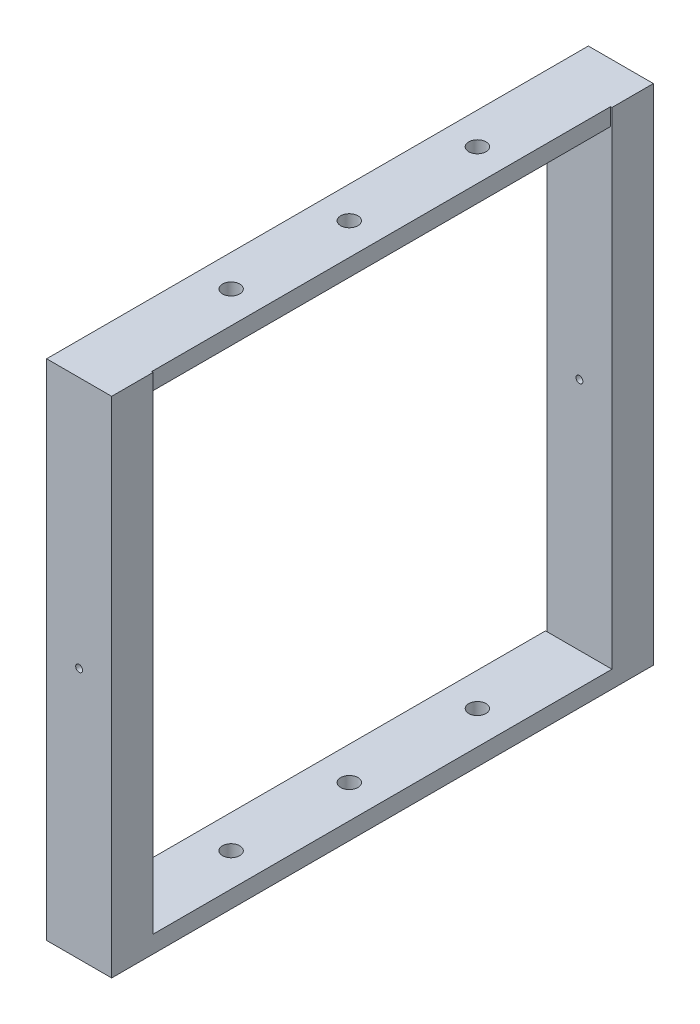
ISO-10303-21;
HEADER;
FILE_DESCRIPTION(('STEP AP214'),'2;1');
FILE_NAME('part.step','',(''),(''),'','','');
FILE_SCHEMA(('AUTOMOTIVE_DESIGN { 1 0 10303 214 1 1 1 1 }'));
ENDSEC;
DATA;
#1=APPLICATION_CONTEXT('core data for automotive mechanical design processes');
#2=APPLICATION_PROTOCOL_DEFINITION('international standard','automotive_design',2000,#1);
#3=PRODUCT_CONTEXT('',#1,'mechanical');
#4=PRODUCT('Part','Part','',(#3));
#5=PRODUCT_RELATED_PRODUCT_CATEGORY('part','',(#4));
#6=PRODUCT_DEFINITION_FORMATION('','',#4);
#7=PRODUCT_DEFINITION_CONTEXT('part definition',#1,'design');
#8=PRODUCT_DEFINITION('design','',#6,#7);
#9=PRODUCT_DEFINITION_SHAPE('','',#8);
#10=(LENGTH_UNIT() NAMED_UNIT(*) SI_UNIT(.MILLI.,.METRE.));
#11=(NAMED_UNIT(*) PLANE_ANGLE_UNIT() SI_UNIT($,.RADIAN.));
#12=(NAMED_UNIT(*) SI_UNIT($,.STERADIAN.) SOLID_ANGLE_UNIT());
#13=UNCERTAINTY_MEASURE_WITH_UNIT(LENGTH_MEASURE(1.E-05),#10,'distance_accuracy_value','');
#14=(GEOMETRIC_REPRESENTATION_CONTEXT(3) GLOBAL_UNCERTAINTY_ASSIGNED_CONTEXT((#13)) GLOBAL_UNIT_ASSIGNED_CONTEXT((#10,
#11,#12)) REPRESENTATION_CONTEXT('',''));
#15=CARTESIAN_POINT('',(0.,0.,0.));
#16=DIRECTION('',(0.,0.,1.));
#17=DIRECTION('',(1.,0.,0.));
#18=AXIS2_PLACEMENT_3D('',#15,#16,#17);
#19=CARTESIAN_POINT('',(-66.5,136.,66.5));
#20=DIRECTION('',(0.,0.,-1.));
#21=DIRECTION('',(-1.,0.,0.));
#22=AXIS2_PLACEMENT_3D('',#19,#20,#21);
#23=PLANE('',#22);
#24=DIRECTION('',(0.,-1.,0.));
#25=VECTOR('',#24,1.);
#26=CARTESIAN_POINT('',(-9.2186374950583,141.,66.5));
#27=LINE('',#26,#25);
#28=CARTESIAN_POINT('',(-9.2186374950583,0.,66.5));
#29=VERTEX_POINT('',#28);
#30=CARTESIAN_POINT('',(-9.2186374950583,-5.,66.5));
#31=VERTEX_POINT('',#30);
#32=EDGE_CURVE('E46',#29,#31,#27,.T.);
#33=ORIENTED_EDGE('',*,*,#32,.F.);
#34=DIRECTION('',(-1.,0.,0.));
#35=VECTOR('',#34,1.);
#36=CARTESIAN_POINT('',(103.5,0.,66.5));
#37=LINE('',#36,#35);
#38=CARTESIAN_POINT('',(-9.63074428145545,0.,66.5));
#39=VERTEX_POINT('',#38);
#40=EDGE_CURVE('E241',#29,#39,#37,.T.);
#41=ORIENTED_EDGE('',*,*,#40,.T.);
#42=DIRECTION('',(0.,1.,0.));
#43=VECTOR('',#42,1.);
#44=CARTESIAN_POINT('',(-9.63074428145545,-5.,66.5));
#45=LINE('',#44,#43);
#46=CARTESIAN_POINT('',(-9.63074428145545,-5.,66.5));
#47=VERTEX_POINT('',#46);
#48=EDGE_CURVE('E175',#47,#39,#45,.T.);
#49=ORIENTED_EDGE('',*,*,#48,.F.);
#50=DIRECTION('',(-1.,0.,0.));
#51=VECTOR('',#50,1.);
#52=CARTESIAN_POINT('',(-9.63074428145545,-5.,66.5));
#53=LINE('',#52,#51);
#54=EDGE_CURVE('E189',#31,#47,#53,.T.);
#55=ORIENTED_EDGE('',*,*,#54,.F.);
#56=EDGE_LOOP('',(#33,#41,#49,#55));
#57=FACE_BOUND('',#56,.T.);
#58=ADVANCED_FACE('F35',(#57),#23,.F.);
#59=CARTESIAN_POINT('',(-66.5,136.,-66.5));
#60=DIRECTION('',(0.,0.,1.));
#61=DIRECTION('',(1.,0.,0.));
#62=AXIS2_PLACEMENT_3D('',#59,#60,#61);
#63=PLANE('',#62);
#64=DIRECTION('',(0.,1.,0.));
#65=VECTOR('',#64,1.);
#66=CARTESIAN_POINT('',(-9.63074428145545,-5.,-66.5));
#67=LINE('',#66,#65);
#68=CARTESIAN_POINT('',(-9.63074428145545,-5.,-66.5));
#69=VERTEX_POINT('',#68);
#70=CARTESIAN_POINT('',(-9.63074428145545,0.,-66.5));
#71=VERTEX_POINT('',#70);
#72=EDGE_CURVE('E197',#69,#71,#67,.T.);
#73=ORIENTED_EDGE('',*,*,#72,.T.);
#74=DIRECTION('',(-1.,0.,0.));
#75=VECTOR('',#74,1.);
#76=CARTESIAN_POINT('',(103.5,0.,-66.5));
#77=LINE('',#76,#75);
#78=CARTESIAN_POINT('',(-9.2186374950583,0.,-66.5));
#79=VERTEX_POINT('',#78);
#80=EDGE_CURVE('E237',#79,#71,#77,.T.);
#81=ORIENTED_EDGE('',*,*,#80,.F.);
#82=DIRECTION('',(0.,1.,0.));
#83=VECTOR('',#82,1.);
#84=CARTESIAN_POINT('',(-9.2186374950583,-5.,-66.5));
#85=LINE('',#84,#83);
#86=CARTESIAN_POINT('',(-9.2186374950583,-5.,-66.5));
#87=VERTEX_POINT('',#86);
#88=EDGE_CURVE('E157',#87,#79,#85,.T.);
#89=ORIENTED_EDGE('',*,*,#88,.F.);
#90=DIRECTION('',(1.,0.,0.));
#91=VECTOR('',#90,1.);
#92=CARTESIAN_POINT('',(-9.63074428145545,-5.,-66.5));
#93=LINE('',#92,#91);
#94=EDGE_CURVE('E194',#69,#87,#93,.T.);
#95=ORIENTED_EDGE('',*,*,#94,.F.);
#96=EDGE_LOOP('',(#73,#81,#89,#95));
#97=FACE_BOUND('',#96,.T.);
#98=ADVANCED_FACE('F37',(#97),#63,.F.);
#99=CARTESIAN_POINT('',(9.63074428145545,-5.,-66.5));
#100=DIRECTION('',(-1.,0.,0.));
#101=DIRECTION('',(0.,0.,1.));
#102=AXIS2_PLACEMENT_3D('',#99,#100,#101);
#103=PLANE('',#102);
#104=DIRECTION('',(0.,0.,1.));
#105=VECTOR('',#104,1.);
#106=CARTESIAN_POINT('',(9.63074428145545,0.,-66.5));
#107=LINE('',#106,#105);
#108=CARTESIAN_POINT('',(9.63074428145545,0.,-66.5));
#109=VERTEX_POINT('',#108);
#110=CARTESIAN_POINT('',(9.63074428145545,0.,66.5));
#111=VERTEX_POINT('',#110);
#112=EDGE_CURVE('E186',#109,#111,#107,.T.);
#113=ORIENTED_EDGE('',*,*,#112,.T.);
#114=DIRECTION('',(0.,1.,0.));
#115=VECTOR('',#114,1.);
#116=CARTESIAN_POINT('',(9.63074428145545,141.,66.5));
#117=LINE('',#116,#115);
#118=CARTESIAN_POINT('',(9.63074428145545,141.,66.5));
#119=VERTEX_POINT('',#118);
#120=EDGE_CURVE('E44',#111,#119,#117,.T.);
#121=ORIENTED_EDGE('',*,*,#120,.T.);
#122=DIRECTION('',(0.,0.,-1.));
#123=VECTOR('',#122,1.);
#124=CARTESIAN_POINT('',(9.63074428145545,141.,78.5));
#125=LINE('',#124,#123);
#126=CARTESIAN_POINT('',(9.63074428145545,141.,78.5));
#127=VERTEX_POINT('',#126);
#128=EDGE_CURVE('E268',#127,#119,#125,.T.);
#129=ORIENTED_EDGE('',*,*,#128,.F.);
#130=DIRECTION('',(0.,1.,0.));
#131=VECTOR('',#130,1.);
#132=CARTESIAN_POINT('',(9.63074428145545,141.,78.5));
#133=LINE('',#132,#131);
#134=CARTESIAN_POINT('',(9.63074428145545,-5.,78.5));
#135=VERTEX_POINT('',#134);
#136=EDGE_CURVE('E264',#135,#127,#133,.T.);
#137=ORIENTED_EDGE('',*,*,#136,.F.);
#138=DIRECTION('',(0.,0.,1.));
#139=VECTOR('',#138,1.);
#140=CARTESIAN_POINT('',(9.63074428145545,-5.,-66.5));
#141=LINE('',#140,#139);
#142=CARTESIAN_POINT('',(9.63074428145545,-5.,-78.5));
#143=VERTEX_POINT('',#142);
#144=EDGE_CURVE('E187',#143,#135,#141,.T.);
#145=ORIENTED_EDGE('',*,*,#144,.F.);
#146=DIRECTION('',(0.,-1.,0.));
#147=VECTOR('',#146,1.);
#148=CARTESIAN_POINT('',(9.63074428145545,-5.,-78.5));
#149=LINE('',#148,#147);
#150=CARTESIAN_POINT('',(9.63074428145545,141.,-78.5));
#151=VERTEX_POINT('',#150);
#152=EDGE_CURVE('E163',#151,#143,#149,.T.);
#153=ORIENTED_EDGE('',*,*,#152,.F.);
#154=DIRECTION('',(0.,0.,1.));
#155=VECTOR('',#154,1.);
#156=CARTESIAN_POINT('',(9.63074428145545,141.,-78.5));
#157=LINE('',#156,#155);
#158=CARTESIAN_POINT('',(9.63074428145545,141.,-66.5));
#159=VERTEX_POINT('',#158);
#160=EDGE_CURVE('E172',#151,#159,#157,.T.);
#161=ORIENTED_EDGE('',*,*,#160,.T.);
#162=DIRECTION('',(0.,-1.,0.));
#163=VECTOR('',#162,1.);
#164=CARTESIAN_POINT('',(9.63074428145545,-5.,-66.5));
#165=LINE('',#164,#163);
#166=EDGE_CURVE('E173',#159,#109,#165,.T.);
#167=ORIENTED_EDGE('',*,*,#166,.T.);
#168=EDGE_LOOP('',(#113,#121,#129,#137,#145,#153,#161,#167));
#169=FACE_BOUND('',#168,.T.);
#170=ADVANCED_FACE('F314',(#169),#103,.F.);
#171=CARTESIAN_POINT('',(-9.63074428145545,-5.,-66.5));
#172=DIRECTION('',(1.,0.,0.));
#173=DIRECTION('',(0.,0.,-1.));
#174=AXIS2_PLACEMENT_3D('',#171,#172,#173);
#175=PLANE('',#174);
#176=DIRECTION('',(0.,0.,-1.));
#177=VECTOR('',#176,1.);
#178=CARTESIAN_POINT('',(-9.63074428145545,0.,-66.5));
#179=LINE('',#178,#177);
#180=EDGE_CURVE('E190',#39,#71,#179,.T.);
#181=ORIENTED_EDGE('',*,*,#180,.T.);
#182=ORIENTED_EDGE('',*,*,#72,.F.);
#183=DIRECTION('',(0.,0.,-1.));
#184=VECTOR('',#183,1.);
#185=CARTESIAN_POINT('',(-9.63074428145545,-5.,-66.5));
#186=LINE('',#185,#184);
#187=EDGE_CURVE('E192',#47,#69,#186,.T.);
#188=ORIENTED_EDGE('',*,*,#187,.F.);
#189=ORIENTED_EDGE('',*,*,#48,.T.);
#190=EDGE_LOOP('',(#181,#182,#188,#189));
#191=FACE_BOUND('',#190,.T.);
#192=ADVANCED_FACE('F289',(#191),#175,.F.);
#193=CARTESIAN_POINT('',(0.,-5.,0.));
#194=DIRECTION('',(0.,1.,0.));
#195=DIRECTION('',(0.,0.,1.));
#196=AXIS2_PLACEMENT_3D('',#193,#194,#195);
#197=PLANE('',#196);
#198=CARTESIAN_POINT('',(0.,-5.,34.2453079122047));
#199=DIRECTION('',(0.,1.,0.));
#200=DIRECTION('',(0.,0.,1.));
#201=AXIS2_PLACEMENT_3D('',#198,#199,#200);
#202=CIRCLE('',#201,2.5);
#203=CARTESIAN_POINT('',(0.,-5.,36.7453079122047));
#204=VERTEX_POINT('',#203);
#205=EDGE_CURVE('E215',#204,#204,#202,.T.);
#206=ORIENTED_EDGE('',*,*,#205,.T.);
#207=EDGE_LOOP('',(#206));
#208=FACE_BOUND('',#207,.T.);
#209=CARTESIAN_POINT('',(0.,-5.,-37.1263663216455));
#210=DIRECTION('',(0.,1.,0.));
#211=DIRECTION('',(0.,0.,1.));
#212=AXIS2_PLACEMENT_3D('',#209,#210,#211);
#213=CIRCLE('',#212,2.5);
#214=CARTESIAN_POINT('',(0.,-5.,-34.6263663216455));
#215=VERTEX_POINT('',#214);
#216=EDGE_CURVE('E212',#215,#215,#213,.T.);
#217=ORIENTED_EDGE('',*,*,#216,.T.);
#218=EDGE_LOOP('',(#217));
#219=FACE_BOUND('',#218,.T.);
#220=CARTESIAN_POINT('',(0.,-5.,0.));
#221=DIRECTION('',(0.,1.,0.));
#222=DIRECTION('',(0.,0.,1.));
#223=AXIS2_PLACEMENT_3D('',#220,#221,#222);
#224=CIRCLE('',#223,2.5);
#225=CARTESIAN_POINT('',(0.,-5.,2.5));
#226=VERTEX_POINT('',#225);
#227=EDGE_CURVE('E235',#226,#226,#224,.T.);
#228=ORIENTED_EDGE('',*,*,#227,.T.);
#229=EDGE_LOOP('',(#228));
#230=FACE_BOUND('',#229,.T.);
#231=ORIENTED_EDGE('',*,*,#144,.T.);
#232=DIRECTION('',(1.,0.,0.));
#233=VECTOR('',#232,1.);
#234=CARTESIAN_POINT('',(-9.2186374950583,-5.,78.5));
#235=LINE('',#234,#233);
#236=CARTESIAN_POINT('',(-9.2186374950583,-5.,78.5));
#237=VERTEX_POINT('',#236);
#238=EDGE_CURVE('E260',#237,#135,#235,.T.);
#239=ORIENTED_EDGE('',*,*,#238,.F.);
#240=DIRECTION('',(0.,0.,-1.));
#241=VECTOR('',#240,1.);
#242=CARTESIAN_POINT('',(-9.2186374950583,-5.,78.5));
#243=LINE('',#242,#241);
#244=EDGE_CURVE('E149',#237,#31,#243,.T.);
#245=ORIENTED_EDGE('',*,*,#244,.T.);
#246=ORIENTED_EDGE('',*,*,#54,.T.);
#247=ORIENTED_EDGE('',*,*,#187,.T.);
#248=ORIENTED_EDGE('',*,*,#94,.T.);
#249=DIRECTION('',(0.,0.,1.));
#250=VECTOR('',#249,1.);
#251=CARTESIAN_POINT('',(-9.2186374950583,-5.,-78.5));
#252=LINE('',#251,#250);
#253=CARTESIAN_POINT('',(-9.2186374950583,-5.,-78.5));
#254=VERTEX_POINT('',#253);
#255=EDGE_CURVE('E183',#254,#87,#252,.T.);
#256=ORIENTED_EDGE('',*,*,#255,.F.);
#257=DIRECTION('',(-1.,0.,0.));
#258=VECTOR('',#257,1.);
#259=CARTESIAN_POINT('',(9.63074428145545,-5.,-78.5));
#260=LINE('',#259,#258);
#261=EDGE_CURVE('E166',#143,#254,#260,.T.);
#262=ORIENTED_EDGE('',*,*,#261,.F.);
#263=EDGE_LOOP('',(#231,#239,#245,#246,#247,#248,#256,#262));
#264=FACE_BOUND('',#263,.T.);
#265=ADVANCED_FACE('F294',(#208,#219,#230,#264),#197,.F.);
#266=CARTESIAN_POINT('',(-9.2186374950583,-5.,-78.5));
#267=DIRECTION('',(1.,0.,0.));
#268=DIRECTION('',(0.,0.,-1.));
#269=AXIS2_PLACEMENT_3D('',#266,#267,#268);
#270=PLANE('',#269);
#271=ORIENTED_EDGE('',*,*,#88,.T.);
#272=CARTESIAN_POINT('',(-9.2186374950583,136.,-66.5));
#273=VERTEX_POINT('',#272);
#274=EDGE_CURVE('E155',#79,#273,#85,.T.);
#275=ORIENTED_EDGE('',*,*,#274,.T.);
#276=DIRECTION('',(0.,0.,1.));
#277=VECTOR('',#276,1.);
#278=CARTESIAN_POINT('',(-9.2186374950583,136.,66.5));
#279=LINE('',#278,#277);
#280=CARTESIAN_POINT('',(-9.2186374950583,136.,66.5));
#281=VERTEX_POINT('',#280);
#282=EDGE_CURVE('E137',#273,#281,#279,.T.);
#283=ORIENTED_EDGE('',*,*,#282,.T.);
#284=EDGE_CURVE('E11',#281,#29,#27,.T.);
#285=ORIENTED_EDGE('',*,*,#284,.T.);
#286=ORIENTED_EDGE('',*,*,#32,.T.);
#287=ORIENTED_EDGE('',*,*,#244,.F.);
#288=DIRECTION('',(0.,-1.,0.));
#289=VECTOR('',#288,1.);
#290=CARTESIAN_POINT('',(-9.2186374950583,141.,78.5));
#291=LINE('',#290,#289);
#292=CARTESIAN_POINT('',(-9.2186374950583,141.,78.5));
#293=VERTEX_POINT('',#292);
#294=EDGE_CURVE('E257',#293,#237,#291,.T.);
#295=ORIENTED_EDGE('',*,*,#294,.F.);
#296=DIRECTION('',(0.,0.,1.));
#297=VECTOR('',#296,1.);
#298=CARTESIAN_POINT('',(-9.2186374950583,141.,-78.5));
#299=LINE('',#298,#297);
#300=CARTESIAN_POINT('',(-9.2186374950583,141.,-78.5));
#301=VERTEX_POINT('',#300);
#302=EDGE_CURVE('E181',#301,#293,#299,.T.);
#303=ORIENTED_EDGE('',*,*,#302,.F.);
#304=DIRECTION('',(0.,1.,0.));
#305=VECTOR('',#304,1.);
#306=CARTESIAN_POINT('',(-9.2186374950583,-5.,-78.5));
#307=LINE('',#306,#305);
#308=EDGE_CURVE('E168',#254,#301,#307,.T.);
#309=ORIENTED_EDGE('',*,*,#308,.F.);
#310=ORIENTED_EDGE('',*,*,#255,.T.);
#311=EDGE_LOOP('',(#271,#275,#283,#285,#286,#287,#295,#303,#309,#310));
#312=FACE_BOUND('',#311,.T.);
#313=ADVANCED_FACE('F277',(#312),#270,.F.);
#314=CARTESIAN_POINT('',(9.63074428145545,141.,-78.5));
#315=DIRECTION('',(0.,-1.,0.));
#316=DIRECTION('',(0.,0.,-1.));
#317=AXIS2_PLACEMENT_3D('',#314,#315,#316);
#318=PLANE('',#317);
#319=CARTESIAN_POINT('',(0.,141.,34.2453079122047));
#320=DIRECTION('',(0.,1.,0.));
#321=DIRECTION('',(0.,0.,1.));
#322=AXIS2_PLACEMENT_3D('',#319,#320,#321);
#323=CIRCLE('',#322,2.5);
#324=CARTESIAN_POINT('',(0.,141.,36.7453079122047));
#325=VERTEX_POINT('',#324);
#326=EDGE_CURVE('E401',#325,#325,#323,.T.);
#327=ORIENTED_EDGE('',*,*,#326,.F.);
#328=EDGE_LOOP('',(#327));
#329=FACE_BOUND('',#328,.T.);
#330=CARTESIAN_POINT('',(0.,141.,-37.1263663216455));
#331=DIRECTION('',(0.,1.,0.));
#332=DIRECTION('',(0.,0.,1.));
#333=AXIS2_PLACEMENT_3D('',#330,#331,#332);
#334=CIRCLE('',#333,2.5);
#335=CARTESIAN_POINT('',(0.,141.,-34.6263663216455));
#336=VERTEX_POINT('',#335);
#337=EDGE_CURVE('E208',#336,#336,#334,.T.);
#338=ORIENTED_EDGE('',*,*,#337,.F.);
#339=EDGE_LOOP('',(#338));
#340=FACE_BOUND('',#339,.T.);
#341=CARTESIAN_POINT('',(0.,141.,0.));
#342=DIRECTION('',(0.,-1.,0.));
#343=DIRECTION('',(0.,0.,-1.));
#344=AXIS2_PLACEMENT_3D('',#341,#342,#343);
#345=CIRCLE('',#344,2.5);
#346=CARTESIAN_POINT('',(0.,141.,-2.5));
#347=VERTEX_POINT('',#346);
#348=EDGE_CURVE('E229',#347,#347,#345,.F.);
#349=ORIENTED_EDGE('',*,*,#348,.F.);
#350=EDGE_LOOP('',(#349));
#351=FACE_BOUND('',#350,.T.);
#352=ORIENTED_EDGE('',*,*,#302,.T.);
#353=DIRECTION('',(-1.,0.,0.));
#354=VECTOR('',#353,1.);
#355=CARTESIAN_POINT('',(-9.2186374950583,141.,78.5));
#356=LINE('',#355,#354);
#357=EDGE_CURVE('E266',#127,#293,#356,.T.);
#358=ORIENTED_EDGE('',*,*,#357,.F.);
#359=ORIENTED_EDGE('',*,*,#128,.T.);
#360=DIRECTION('',(-1.,0.,0.));
#361=VECTOR('',#360,1.);
#362=CARTESIAN_POINT('',(-9.2186374950583,141.,66.5));
#363=LINE('',#362,#361);
#364=CARTESIAN_POINT('',(9.21863749505819,141.,66.5));
#365=VERTEX_POINT('',#364);
#366=EDGE_CURVE('E261',#119,#365,#363,.T.);
#367=ORIENTED_EDGE('',*,*,#366,.T.);
#368=DIRECTION('',(0.,0.,-1.));
#369=VECTOR('',#368,1.);
#370=CARTESIAN_POINT('',(9.21863749505819,141.,66.5));
#371=LINE('',#370,#369);
#372=CARTESIAN_POINT('',(9.21863749505819,141.,-66.5));
#373=VERTEX_POINT('',#372);
#374=EDGE_CURVE('E159',#365,#373,#371,.T.);
#375=ORIENTED_EDGE('',*,*,#374,.T.);
#376=DIRECTION('',(1.,0.,0.));
#377=VECTOR('',#376,1.);
#378=CARTESIAN_POINT('',(9.63074428145545,141.,-66.5));
#379=LINE('',#378,#377);
#380=EDGE_CURVE('E154',#373,#159,#379,.T.);
#381=ORIENTED_EDGE('',*,*,#380,.T.);
#382=ORIENTED_EDGE('',*,*,#160,.F.);
#383=DIRECTION('',(1.,0.,0.));
#384=VECTOR('',#383,1.);
#385=CARTESIAN_POINT('',(9.63074428145545,141.,-78.5));
#386=LINE('',#385,#384);
#387=EDGE_CURVE('E170',#301,#151,#386,.T.);
#388=ORIENTED_EDGE('',*,*,#387,.F.);
#389=EDGE_LOOP('',(#352,#358,#359,#367,#375,#381,#382,#388));
#390=FACE_BOUND('',#389,.T.);
#391=ADVANCED_FACE('F305',(#329,#340,#351,#390),#318,.F.);
#392=CARTESIAN_POINT('',(0.,0.,-78.5));
#393=DIRECTION('',(0.,0.,1.));
#394=DIRECTION('',(1.,0.,0.));
#395=AXIS2_PLACEMENT_3D('',#392,#393,#394);
#396=PLANE('',#395);
#397=CARTESIAN_POINT('',(0.206053393198581,68.,-78.5));
#398=DIRECTION('',(0.,0.,1.));
#399=DIRECTION('',(1.,0.,0.));
#400=AXIS2_PLACEMENT_3D('',#397,#398,#399);
#401=CIRCLE('',#400,1.);
#402=CARTESIAN_POINT('',(1.20605339319858,68.,-78.5));
#403=VERTEX_POINT('',#402);
#404=EDGE_CURVE('E246',#403,#403,#401,.T.);
#405=ORIENTED_EDGE('',*,*,#404,.T.);
#406=EDGE_LOOP('',(#405));
#407=FACE_BOUND('',#406,.T.);
#408=ORIENTED_EDGE('',*,*,#152,.T.);
#409=ORIENTED_EDGE('',*,*,#261,.T.);
#410=ORIENTED_EDGE('',*,*,#308,.T.);
#411=ORIENTED_EDGE('',*,*,#387,.T.);
#412=EDGE_LOOP('',(#408,#409,#410,#411));
#413=FACE_BOUND('',#412,.T.);
#414=ADVANCED_FACE('F310',(#407,#413),#396,.F.);
#415=CARTESIAN_POINT('',(0.,0.,-66.5));
#416=DIRECTION('',(0.,0.,1.));
#417=DIRECTION('',(1.,0.,0.));
#418=AXIS2_PLACEMENT_3D('',#415,#416,#417);
#419=PLANE('',#418);
#420=CARTESIAN_POINT('',(0.206053393198581,68.,-66.5));
#421=DIRECTION('',(0.,0.,1.));
#422=DIRECTION('',(1.,0.,0.));
#423=AXIS2_PLACEMENT_3D('',#420,#421,#422);
#424=CIRCLE('',#423,1.);
#425=CARTESIAN_POINT('',(1.20605339319858,68.,-66.5));
#426=VERTEX_POINT('',#425);
#427=EDGE_CURVE('E254',#426,#426,#424,.T.);
#428=ORIENTED_EDGE('',*,*,#427,.F.);
#429=EDGE_LOOP('',(#428));
#430=FACE_BOUND('',#429,.T.);
#431=ORIENTED_EDGE('',*,*,#166,.F.);
#432=ORIENTED_EDGE('',*,*,#380,.F.);
#433=DIRECTION('',(0.,-1.,0.));
#434=VECTOR('',#433,1.);
#435=CARTESIAN_POINT('',(9.21863749505819,141.,-66.5));
#436=LINE('',#435,#434);
#437=CARTESIAN_POINT('',(9.21863749505819,136.,-66.5));
#438=VERTEX_POINT('',#437);
#439=EDGE_CURVE('E145',#373,#438,#436,.T.);
#440=ORIENTED_EDGE('',*,*,#439,.T.);
#441=DIRECTION('',(-1.,0.,0.));
#442=VECTOR('',#441,1.);
#443=CARTESIAN_POINT('',(103.5,136.,-66.5));
#444=LINE('',#443,#442);
#445=EDGE_CURVE('E131',#438,#273,#444,.T.);
#446=ORIENTED_EDGE('',*,*,#445,.T.);
#447=ORIENTED_EDGE('',*,*,#274,.F.);
#448=EDGE_CURVE('E244',#109,#79,#77,.T.);
#449=ORIENTED_EDGE('',*,*,#448,.F.);
#450=EDGE_LOOP('',(#431,#432,#440,#446,#447,#449));
#451=FACE_BOUND('',#450,.T.);
#452=ADVANCED_FACE('F152',(#430,#451),#419,.T.);
#453=CARTESIAN_POINT('',(9.21863749505819,141.,66.5));
#454=DIRECTION('',(-1.,0.,0.));
#455=DIRECTION('',(0.,0.,1.));
#456=AXIS2_PLACEMENT_3D('',#453,#454,#455);
#457=PLANE('',#456);
#458=DIRECTION('',(0.,0.,-1.));
#459=VECTOR('',#458,1.);
#460=CARTESIAN_POINT('',(9.21863749505819,136.,66.5));
#461=LINE('',#460,#459);
#462=CARTESIAN_POINT('',(9.21863749505819,136.,66.5));
#463=VERTEX_POINT('',#462);
#464=EDGE_CURVE('E135',#463,#438,#461,.T.);
#465=ORIENTED_EDGE('',*,*,#464,.T.);
#466=ORIENTED_EDGE('',*,*,#439,.F.);
#467=ORIENTED_EDGE('',*,*,#374,.F.);
#468=DIRECTION('',(0.,-1.,0.));
#469=VECTOR('',#468,1.);
#470=CARTESIAN_POINT('',(9.21863749505819,141.,66.5));
#471=LINE('',#470,#469);
#472=EDGE_CURVE('E148',#365,#463,#471,.T.);
#473=ORIENTED_EDGE('',*,*,#472,.T.);
#474=EDGE_LOOP('',(#465,#466,#467,#473));
#475=FACE_BOUND('',#474,.T.);
#476=ADVANCED_FACE('F144',(#475),#457,.F.);
#477=CARTESIAN_POINT('',(0.,0.,66.5));
#478=DIRECTION('',(0.,0.,1.));
#479=DIRECTION('',(1.,0.,0.));
#480=AXIS2_PLACEMENT_3D('',#477,#478,#479);
#481=PLANE('',#480);
#482=CARTESIAN_POINT('',(0.206053393198581,68.,66.5));
#483=DIRECTION('',(0.,0.,1.));
#484=DIRECTION('',(1.,0.,0.));
#485=AXIS2_PLACEMENT_3D('',#482,#483,#484);
#486=CIRCLE('',#485,1.);
#487=CARTESIAN_POINT('',(1.20605339319858,68.,66.5));
#488=VERTEX_POINT('',#487);
#489=EDGE_CURVE('E249',#488,#488,#486,.T.);
#490=ORIENTED_EDGE('',*,*,#489,.T.);
#491=EDGE_LOOP('',(#490));
#492=FACE_BOUND('',#491,.T.);
#493=ORIENTED_EDGE('',*,*,#120,.F.);
#494=EDGE_CURVE('E240',#111,#29,#37,.T.);
#495=ORIENTED_EDGE('',*,*,#494,.T.);
#496=ORIENTED_EDGE('',*,*,#284,.F.);
#497=DIRECTION('',(-1.,0.,0.));
#498=VECTOR('',#497,1.);
#499=CARTESIAN_POINT('',(103.5,136.,66.5));
#500=LINE('',#499,#498);
#501=EDGE_CURVE('E141',#463,#281,#500,.T.);
#502=ORIENTED_EDGE('',*,*,#501,.F.);
#503=ORIENTED_EDGE('',*,*,#472,.F.);
#504=ORIENTED_EDGE('',*,*,#366,.F.);
#505=EDGE_LOOP('',(#493,#495,#496,#502,#503,#504));
#506=FACE_BOUND('',#505,.T.);
#507=ADVANCED_FACE('F316',(#492,#506),#481,.F.);
#508=CARTESIAN_POINT('',(0.,0.,78.5));
#509=DIRECTION('',(0.,0.,1.));
#510=DIRECTION('',(1.,0.,0.));
#511=AXIS2_PLACEMENT_3D('',#508,#509,#510);
#512=PLANE('',#511);
#513=CARTESIAN_POINT('',(0.206053393198581,68.,78.5));
#514=DIRECTION('',(0.,0.,1.));
#515=DIRECTION('',(1.,0.,0.));
#516=AXIS2_PLACEMENT_3D('',#513,#514,#515);
#517=CIRCLE('',#516,1.);
#518=CARTESIAN_POINT('',(1.20605339319858,68.,78.5));
#519=VERTEX_POINT('',#518);
#520=EDGE_CURVE('E140',#519,#519,#517,.T.);
#521=ORIENTED_EDGE('',*,*,#520,.F.);
#522=EDGE_LOOP('',(#521));
#523=FACE_BOUND('',#522,.T.);
#524=ORIENTED_EDGE('',*,*,#294,.T.);
#525=ORIENTED_EDGE('',*,*,#238,.T.);
#526=ORIENTED_EDGE('',*,*,#136,.T.);
#527=ORIENTED_EDGE('',*,*,#357,.T.);
#528=EDGE_LOOP('',(#524,#525,#526,#527));
#529=FACE_BOUND('',#528,.T.);
#530=ADVANCED_FACE('F300',(#523,#529),#512,.T.);
#531=CARTESIAN_POINT('',(0.206053393198581,68.,-78.5));
#532=DIRECTION('',(0.,0.,1.));
#533=DIRECTION('',(1.,0.,0.));
#534=AXIS2_PLACEMENT_3D('',#531,#532,#533);
#535=CYLINDRICAL_SURFACE('',#534,1.);
#536=ORIENTED_EDGE('',*,*,#520,.T.);
#537=EDGE_LOOP('',(#536));
#538=FACE_BOUND('',#537,.T.);
#539=ORIENTED_EDGE('',*,*,#489,.F.);
#540=EDGE_LOOP('',(#539));
#541=FACE_BOUND('',#540,.T.);
#542=ADVANCED_FACE('F324',(#538,#541),#535,.F.);
#543=ORIENTED_EDGE('',*,*,#427,.T.);
#544=EDGE_LOOP('',(#543));
#545=FACE_BOUND('',#544,.T.);
#546=ORIENTED_EDGE('',*,*,#404,.F.);
#547=EDGE_LOOP('',(#546));
#548=FACE_BOUND('',#547,.T.);
#549=ADVANCED_FACE('F354',(#545,#548),#535,.F.);
#550=CARTESIAN_POINT('',(103.5,136.,-66.5));
#551=DIRECTION('',(0.,1.,0.));
#552=DIRECTION('',(0.,0.,1.));
#553=AXIS2_PLACEMENT_3D('',#550,#551,#552);
#554=PLANE('',#553);
#555=CARTESIAN_POINT('',(0.,136.,34.2453079122047));
#556=DIRECTION('',(0.,1.,0.));
#557=DIRECTION('',(0.,0.,1.));
#558=AXIS2_PLACEMENT_3D('',#555,#556,#557);
#559=CIRCLE('',#558,2.5);
#560=CARTESIAN_POINT('',(0.,136.,36.7453079122047));
#561=VERTEX_POINT('',#560);
#562=EDGE_CURVE('E220',#561,#561,#559,.T.);
#563=ORIENTED_EDGE('',*,*,#562,.T.);
#564=EDGE_LOOP('',(#563));
#565=FACE_BOUND('',#564,.T.);
#566=CARTESIAN_POINT('',(0.,136.,-37.1263663216455));
#567=DIRECTION('',(0.,1.,0.));
#568=DIRECTION('',(0.,0.,1.));
#569=AXIS2_PLACEMENT_3D('',#566,#567,#568);
#570=CIRCLE('',#569,2.5);
#571=CARTESIAN_POINT('',(0.,136.,-34.6263663216455));
#572=VERTEX_POINT('',#571);
#573=EDGE_CURVE('E207',#572,#572,#570,.T.);
#574=ORIENTED_EDGE('',*,*,#573,.T.);
#575=EDGE_LOOP('',(#574));
#576=FACE_BOUND('',#575,.T.);
#577=CARTESIAN_POINT('',(0.,136.,0.));
#578=DIRECTION('',(0.,1.,0.));
#579=DIRECTION('',(0.,0.,1.));
#580=AXIS2_PLACEMENT_3D('',#577,#578,#579);
#581=CIRCLE('',#580,2.5);
#582=CARTESIAN_POINT('',(0.,136.,2.5));
#583=VERTEX_POINT('',#582);
#584=EDGE_CURVE('E226',#583,#583,#581,.F.);
#585=ORIENTED_EDGE('',*,*,#584,.F.);
#586=EDGE_LOOP('',(#585));
#587=FACE_BOUND('',#586,.T.);
#588=ORIENTED_EDGE('',*,*,#445,.F.);
#589=ORIENTED_EDGE('',*,*,#464,.F.);
#590=ORIENTED_EDGE('',*,*,#501,.T.);
#591=ORIENTED_EDGE('',*,*,#282,.F.);
#592=EDGE_LOOP('',(#588,#589,#590,#591));
#593=FACE_BOUND('',#592,.T.);
#594=ADVANCED_FACE('F133',(#565,#576,#587,#593),#554,.F.);
#595=CARTESIAN_POINT('',(103.5,0.,-66.5));
#596=DIRECTION('',(0.,-1.,0.));
#597=DIRECTION('',(0.,0.,-1.));
#598=AXIS2_PLACEMENT_3D('',#595,#596,#597);
#599=PLANE('',#598);
#600=CARTESIAN_POINT('',(0.,0.,34.2453079122047));
#601=DIRECTION('',(0.,-1.,0.));
#602=DIRECTION('',(0.,0.,-1.));
#603=AXIS2_PLACEMENT_3D('',#600,#601,#602);
#604=CIRCLE('',#603,2.5);
#605=CARTESIAN_POINT('',(0.,0.,31.7453079122047));
#606=VERTEX_POINT('',#605);
#607=EDGE_CURVE('E39',#606,#606,#604,.T.);
#608=ORIENTED_EDGE('',*,*,#607,.T.);
#609=EDGE_LOOP('',(#608));
#610=FACE_BOUND('',#609,.T.);
#611=CARTESIAN_POINT('',(0.,0.,-37.1263663216455));
#612=DIRECTION('',(0.,-1.,0.));
#613=DIRECTION('',(0.,0.,-1.));
#614=AXIS2_PLACEMENT_3D('',#611,#612,#613);
#615=CIRCLE('',#614,2.5);
#616=CARTESIAN_POINT('',(0.,0.,-39.6263663216455));
#617=VERTEX_POINT('',#616);
#618=EDGE_CURVE('E205',#617,#617,#615,.T.);
#619=ORIENTED_EDGE('',*,*,#618,.T.);
#620=EDGE_LOOP('',(#619));
#621=FACE_BOUND('',#620,.T.);
#622=CARTESIAN_POINT('',(0.,0.,0.));
#623=DIRECTION('',(0.,1.,0.));
#624=DIRECTION('',(0.,0.,1.));
#625=AXIS2_PLACEMENT_3D('',#622,#623,#624);
#626=CIRCLE('',#625,2.5);
#627=CARTESIAN_POINT('',(0.,0.,2.5));
#628=VERTEX_POINT('',#627);
#629=EDGE_CURVE('E232',#628,#628,#626,.T.);
#630=ORIENTED_EDGE('',*,*,#629,.F.);
#631=EDGE_LOOP('',(#630));
#632=FACE_BOUND('',#631,.T.);
#633=ORIENTED_EDGE('',*,*,#448,.T.);
#634=ORIENTED_EDGE('',*,*,#80,.T.);
#635=ORIENTED_EDGE('',*,*,#180,.F.);
#636=ORIENTED_EDGE('',*,*,#40,.F.);
#637=ORIENTED_EDGE('',*,*,#494,.F.);
#638=ORIENTED_EDGE('',*,*,#112,.F.);
#639=EDGE_LOOP('',(#633,#634,#635,#636,#637,#638));
#640=FACE_BOUND('',#639,.T.);
#641=ADVANCED_FACE('F282',(#610,#621,#632,#640),#599,.F.);
#642=CARTESIAN_POINT('',(0.,-10.,0.));
#643=DIRECTION('',(0.,1.,0.));
#644=DIRECTION('',(0.,0.,1.));
#645=AXIS2_PLACEMENT_3D('',#642,#643,#644);
#646=CYLINDRICAL_SURFACE('',#645,2.5);
#647=ORIENTED_EDGE('',*,*,#629,.T.);
#648=EDGE_LOOP('',(#647));
#649=FACE_BOUND('',#648,.T.);
#650=ORIENTED_EDGE('',*,*,#227,.F.);
#651=EDGE_LOOP('',(#650));
#652=FACE_BOUND('',#651,.T.);
#653=ADVANCED_FACE('F367',(#649,#652),#646,.F.);
#654=CARTESIAN_POINT('',(0.,170.,0.));
#655=DIRECTION('',(0.,-1.,0.));
#656=DIRECTION('',(0.,0.,-1.));
#657=AXIS2_PLACEMENT_3D('',#654,#655,#656);
#658=CYLINDRICAL_SURFACE('',#657,2.5);
#659=ORIENTED_EDGE('',*,*,#584,.T.);
#660=EDGE_LOOP('',(#659));
#661=FACE_BOUND('',#660,.T.);
#662=ORIENTED_EDGE('',*,*,#348,.T.);
#663=EDGE_LOOP('',(#662));
#664=FACE_BOUND('',#663,.T.);
#665=ADVANCED_FACE('F372',(#661,#664),#658,.F.);
#666=CARTESIAN_POINT('',(0.,-37.0000000000001,-37.1263663216455));
#667=DIRECTION('',(0.,1.,0.));
#668=DIRECTION('',(0.,0.,1.));
#669=AXIS2_PLACEMENT_3D('',#666,#667,#668);
#670=CYLINDRICAL_SURFACE('',#669,2.5);
#671=ORIENTED_EDGE('',*,*,#618,.F.);
#672=EDGE_LOOP('',(#671));
#673=FACE_BOUND('',#672,.T.);
#674=ORIENTED_EDGE('',*,*,#216,.F.);
#675=EDGE_LOOP('',(#674));
#676=FACE_BOUND('',#675,.T.);
#677=ADVANCED_FACE('F376',(#673,#676),#670,.F.);
#678=ORIENTED_EDGE('',*,*,#337,.T.);
#679=EDGE_LOOP('',(#678));
#680=FACE_BOUND('',#679,.T.);
#681=ORIENTED_EDGE('',*,*,#573,.F.);
#682=EDGE_LOOP('',(#681));
#683=FACE_BOUND('',#682,.T.);
#684=ADVANCED_FACE('F380',(#680,#683),#670,.F.);
#685=CARTESIAN_POINT('',(0.,-37.0000000000001,34.2453079122047));
#686=DIRECTION('',(0.,1.,0.));
#687=DIRECTION('',(0.,0.,1.));
#688=AXIS2_PLACEMENT_3D('',#685,#686,#687);
#689=CYLINDRICAL_SURFACE('',#688,2.5);
#690=ORIENTED_EDGE('',*,*,#607,.F.);
#691=EDGE_LOOP('',(#690));
#692=FACE_BOUND('',#691,.T.);
#693=ORIENTED_EDGE('',*,*,#205,.F.);
#694=EDGE_LOOP('',(#693));
#695=FACE_BOUND('',#694,.T.);
#696=ADVANCED_FACE('F382',(#692,#695),#689,.F.);
#697=ORIENTED_EDGE('',*,*,#326,.T.);
#698=EDGE_LOOP('',(#697));
#699=FACE_BOUND('',#698,.T.);
#700=ORIENTED_EDGE('',*,*,#562,.F.);
#701=EDGE_LOOP('',(#700));
#702=FACE_BOUND('',#701,.T.);
#703=ADVANCED_FACE('F384',(#699,#702),#689,.F.);
#704=CLOSED_SHELL('',(#58,#98,#170,#192,#265,#313,#391,#414,#452,#476,#507,#530,#542,#549,#594,
#641,#653,#665,#677,#684,#696,#703));
#705=MANIFOLD_SOLID_BREP('B2',#704);
#706=ADVANCED_BREP_SHAPE_REPRESENTATION('',(#18,#705),#14);
#707=SHAPE_DEFINITION_REPRESENTATION(#9,#706);
ENDSEC;
END-ISO-10303-21;
